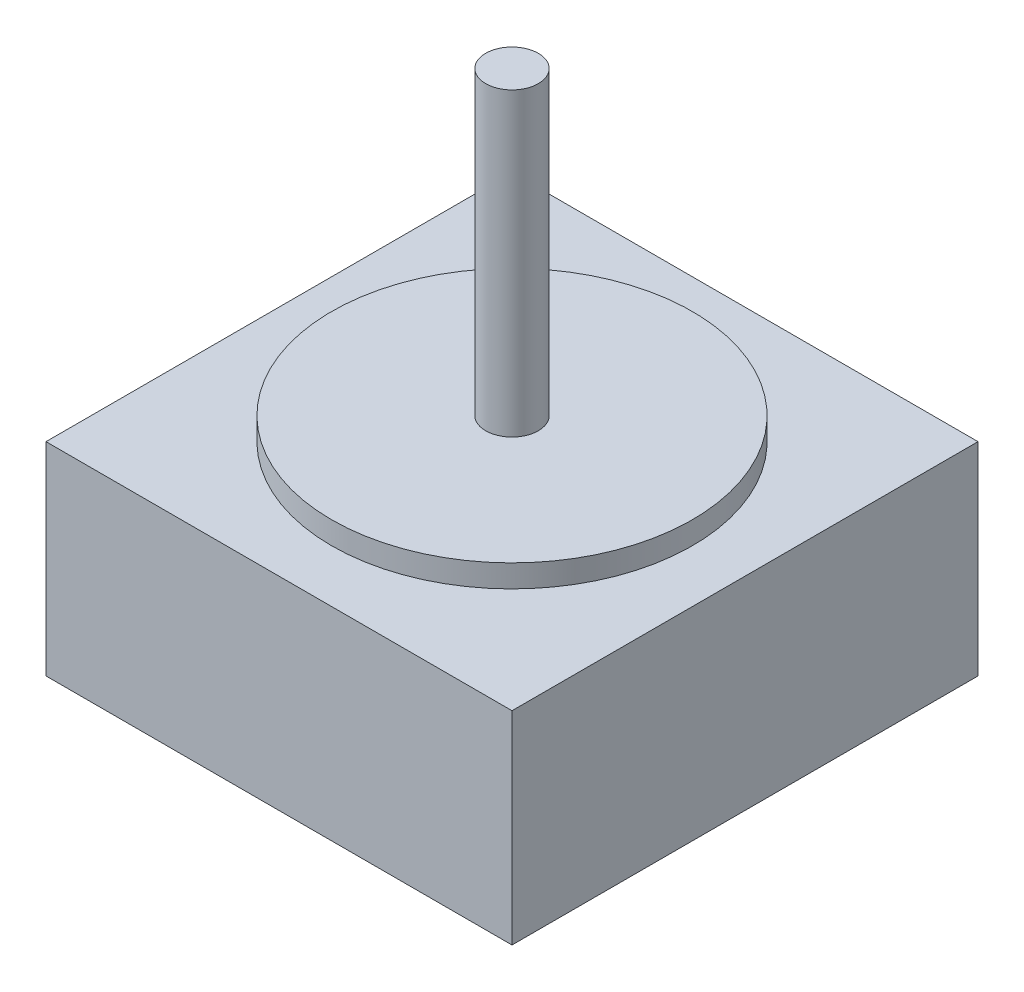
ISO-10303-21;
HEADER;
FILE_DESCRIPTION(('STEP AP214'),'2;1');
FILE_NAME('part.step','',(''),(''),'','','');
FILE_SCHEMA(('AUTOMOTIVE_DESIGN { 1 0 10303 214 1 1 1 1 }'));
ENDSEC;
DATA;
#1=APPLICATION_CONTEXT('core data for automotive mechanical design processes');
#2=APPLICATION_PROTOCOL_DEFINITION('international standard','automotive_design',2000,#1);
#3=PRODUCT_CONTEXT('',#1,'mechanical');
#4=PRODUCT('Part','Part','',(#3));
#5=PRODUCT_RELATED_PRODUCT_CATEGORY('part','',(#4));
#6=PRODUCT_DEFINITION_FORMATION('','',#4);
#7=PRODUCT_DEFINITION_CONTEXT('part definition',#1,'design');
#8=PRODUCT_DEFINITION('design','',#6,#7);
#9=PRODUCT_DEFINITION_SHAPE('','',#8);
#10=(LENGTH_UNIT() NAMED_UNIT(*) SI_UNIT(.MILLI.,.METRE.));
#11=(NAMED_UNIT(*) PLANE_ANGLE_UNIT() SI_UNIT($,.RADIAN.));
#12=(NAMED_UNIT(*) SI_UNIT($,.STERADIAN.) SOLID_ANGLE_UNIT());
#13=UNCERTAINTY_MEASURE_WITH_UNIT(LENGTH_MEASURE(1.E-05),#10,'distance_accuracy_value','');
#14=(GEOMETRIC_REPRESENTATION_CONTEXT(3) GLOBAL_UNCERTAINTY_ASSIGNED_CONTEXT((#13)) GLOBAL_UNIT_ASSIGNED_CONTEXT((#10,
#11,#12)) REPRESENTATION_CONTEXT('',''));
#15=CARTESIAN_POINT('',(0.,0.,0.));
#16=DIRECTION('',(0.,0.,1.));
#17=DIRECTION('',(1.,0.,0.));
#18=AXIS2_PLACEMENT_3D('',#15,#16,#17);
#19=CARTESIAN_POINT('',(31.,27.,31.));
#20=DIRECTION('',(-1.,0.,0.));
#21=DIRECTION('',(0.,0.,1.));
#22=AXIS2_PLACEMENT_3D('',#19,#20,#21);
#23=PLANE('',#22);
#24=DIRECTION('',(0.,0.,-1.));
#25=VECTOR('',#24,1.);
#26=CARTESIAN_POINT('',(31.,0.,31.));
#27=LINE('',#26,#25);
#28=CARTESIAN_POINT('',(31.,0.,31.));
#29=VERTEX_POINT('',#28);
#30=CARTESIAN_POINT('',(31.,0.,-31.));
#31=VERTEX_POINT('',#30);
#32=EDGE_CURVE('E105',#29,#31,#27,.T.);
#33=ORIENTED_EDGE('',*,*,#32,.T.);
#34=DIRECTION('',(0.,-1.,0.));
#35=VECTOR('',#34,1.);
#36=CARTESIAN_POINT('',(31.,27.,-31.));
#37=LINE('',#36,#35);
#38=CARTESIAN_POINT('',(31.,27.,-31.));
#39=VERTEX_POINT('',#38);
#40=EDGE_CURVE('E42',#39,#31,#37,.T.);
#41=ORIENTED_EDGE('',*,*,#40,.F.);
#42=DIRECTION('',(0.,0.,-1.));
#43=VECTOR('',#42,1.);
#44=CARTESIAN_POINT('',(31.,27.,31.));
#45=LINE('',#44,#43);
#46=CARTESIAN_POINT('',(31.,27.,31.));
#47=VERTEX_POINT('',#46);
#48=EDGE_CURVE('E92',#47,#39,#45,.T.);
#49=ORIENTED_EDGE('',*,*,#48,.F.);
#50=DIRECTION('',(0.,-1.,0.));
#51=VECTOR('',#50,1.);
#52=CARTESIAN_POINT('',(31.,27.,31.));
#53=LINE('',#52,#51);
#54=EDGE_CURVE('E101',#47,#29,#53,.T.);
#55=ORIENTED_EDGE('',*,*,#54,.T.);
#56=EDGE_LOOP('',(#33,#41,#49,#55));
#57=FACE_BOUND('',#56,.T.);
#58=ADVANCED_FACE('F39',(#57),#23,.F.);
#59=CARTESIAN_POINT('',(-31.,27.,-31.));
#60=DIRECTION('',(0.,0.,1.));
#61=DIRECTION('',(1.,0.,0.));
#62=AXIS2_PLACEMENT_3D('',#59,#60,#61);
#63=PLANE('',#62);
#64=DIRECTION('',(-1.,0.,0.));
#65=VECTOR('',#64,1.);
#66=CARTESIAN_POINT('',(-31.,0.,-31.));
#67=LINE('',#66,#65);
#68=CARTESIAN_POINT('',(-31.,0.,-31.));
#69=VERTEX_POINT('',#68);
#70=EDGE_CURVE('E97',#31,#69,#67,.T.);
#71=ORIENTED_EDGE('',*,*,#70,.T.);
#72=DIRECTION('',(0.,-1.,0.));
#73=VECTOR('',#72,1.);
#74=CARTESIAN_POINT('',(-31.,27.,-31.));
#75=LINE('',#74,#73);
#76=CARTESIAN_POINT('',(-31.,27.,-31.));
#77=VERTEX_POINT('',#76);
#78=EDGE_CURVE('E95',#77,#69,#75,.T.);
#79=ORIENTED_EDGE('',*,*,#78,.F.);
#80=DIRECTION('',(-1.,0.,0.));
#81=VECTOR('',#80,1.);
#82=CARTESIAN_POINT('',(-31.,27.,-31.));
#83=LINE('',#82,#81);
#84=EDGE_CURVE('E87',#39,#77,#83,.T.);
#85=ORIENTED_EDGE('',*,*,#84,.F.);
#86=ORIENTED_EDGE('',*,*,#40,.T.);
#87=EDGE_LOOP('',(#71,#79,#85,#86));
#88=FACE_BOUND('',#87,.T.);
#89=ADVANCED_FACE('F96',(#88),#63,.F.);
#90=CARTESIAN_POINT('',(-31.,27.,31.));
#91=DIRECTION('',(1.,0.,0.));
#92=DIRECTION('',(0.,0.,-1.));
#93=AXIS2_PLACEMENT_3D('',#90,#91,#92);
#94=PLANE('',#93);
#95=DIRECTION('',(0.,0.,1.));
#96=VECTOR('',#95,1.);
#97=CARTESIAN_POINT('',(-31.,0.,31.));
#98=LINE('',#97,#96);
#99=CARTESIAN_POINT('',(-31.,0.,31.));
#100=VERTEX_POINT('',#99);
#101=EDGE_CURVE('E73',#69,#100,#98,.T.);
#102=ORIENTED_EDGE('',*,*,#101,.T.);
#103=DIRECTION('',(0.,-1.,0.));
#104=VECTOR('',#103,1.);
#105=CARTESIAN_POINT('',(-31.,27.,31.));
#106=LINE('',#105,#104);
#107=CARTESIAN_POINT('',(-31.,27.,31.));
#108=VERTEX_POINT('',#107);
#109=EDGE_CURVE('E98',#108,#100,#106,.T.);
#110=ORIENTED_EDGE('',*,*,#109,.F.);
#111=DIRECTION('',(0.,0.,1.));
#112=VECTOR('',#111,1.);
#113=CARTESIAN_POINT('',(-31.,27.,31.));
#114=LINE('',#113,#112);
#115=EDGE_CURVE('E90',#77,#108,#114,.T.);
#116=ORIENTED_EDGE('',*,*,#115,.F.);
#117=ORIENTED_EDGE('',*,*,#78,.T.);
#118=EDGE_LOOP('',(#102,#110,#116,#117));
#119=FACE_BOUND('',#118,.T.);
#120=ADVANCED_FACE('F99',(#119),#94,.F.);
#121=CARTESIAN_POINT('',(-31.,27.,31.));
#122=DIRECTION('',(0.,0.,-1.));
#123=DIRECTION('',(-1.,0.,0.));
#124=AXIS2_PLACEMENT_3D('',#121,#122,#123);
#125=PLANE('',#124);
#126=DIRECTION('',(1.,0.,0.));
#127=VECTOR('',#126,1.);
#128=CARTESIAN_POINT('',(-31.,0.,31.));
#129=LINE('',#128,#127);
#130=EDGE_CURVE('E79',#100,#29,#129,.T.);
#131=ORIENTED_EDGE('',*,*,#130,.T.);
#132=ORIENTED_EDGE('',*,*,#54,.F.);
#133=DIRECTION('',(1.,0.,0.));
#134=VECTOR('',#133,1.);
#135=CARTESIAN_POINT('',(-31.,27.,31.));
#136=LINE('',#135,#134);
#137=EDGE_CURVE('E56',#108,#47,#136,.T.);
#138=ORIENTED_EDGE('',*,*,#137,.F.);
#139=ORIENTED_EDGE('',*,*,#109,.T.);
#140=EDGE_LOOP('',(#131,#132,#138,#139));
#141=FACE_BOUND('',#140,.T.);
#142=ADVANCED_FACE('F113',(#141),#125,.F.);
#143=CARTESIAN_POINT('',(0.,27.,0.));
#144=DIRECTION('',(0.,-1.,0.));
#145=DIRECTION('',(0.,0.,-1.));
#146=AXIS2_PLACEMENT_3D('',#143,#144,#145);
#147=PLANE('',#146);
#148=CARTESIAN_POINT('',(0.,27.,0.));
#149=DIRECTION('',(0.,1.,0.));
#150=DIRECTION('',(0.,0.,1.));
#151=AXIS2_PLACEMENT_3D('',#148,#149,#150);
#152=CIRCLE('',#151,24.);
#153=CARTESIAN_POINT('',(0.,27.,24.));
#154=VERTEX_POINT('',#153);
#155=EDGE_CURVE('E11',#154,#154,#152,.T.);
#156=ORIENTED_EDGE('',*,*,#155,.F.);
#157=EDGE_LOOP('',(#156));
#158=FACE_BOUND('',#157,.T.);
#159=ORIENTED_EDGE('',*,*,#48,.T.);
#160=ORIENTED_EDGE('',*,*,#84,.T.);
#161=ORIENTED_EDGE('',*,*,#115,.T.);
#162=ORIENTED_EDGE('',*,*,#137,.T.);
#163=EDGE_LOOP('',(#159,#160,#161,#162));
#164=FACE_BOUND('',#163,.T.);
#165=ADVANCED_FACE('F88',(#158,#164),#147,.F.);
#166=CARTESIAN_POINT('',(0.,0.,0.));
#167=DIRECTION('',(0.,-1.,0.));
#168=DIRECTION('',(0.,0.,-1.));
#169=AXIS2_PLACEMENT_3D('',#166,#167,#168);
#170=PLANE('',#169);
#171=ORIENTED_EDGE('',*,*,#32,.F.);
#172=ORIENTED_EDGE('',*,*,#130,.F.);
#173=ORIENTED_EDGE('',*,*,#101,.F.);
#174=ORIENTED_EDGE('',*,*,#70,.F.);
#175=EDGE_LOOP('',(#171,#172,#173,#174));
#176=FACE_BOUND('',#175,.T.);
#177=ADVANCED_FACE('F116',(#176),#170,.T.);
#178=CARTESIAN_POINT('',(0.,30.,0.));
#179=DIRECTION('',(0.,-1.,0.));
#180=DIRECTION('',(0.,0.,-1.));
#181=AXIS2_PLACEMENT_3D('',#178,#179,#180);
#182=CYLINDRICAL_SURFACE('',#181,24.);
#183=CARTESIAN_POINT('',(0.,30.,0.));
#184=DIRECTION('',(0.,1.,0.));
#185=DIRECTION('',(0.,0.,1.));
#186=AXIS2_PLACEMENT_3D('',#183,#184,#185);
#187=CIRCLE('',#186,24.);
#188=CARTESIAN_POINT('',(0.,30.,24.));
#189=VERTEX_POINT('',#188);
#190=EDGE_CURVE('E108',#189,#189,#187,.T.);
#191=ORIENTED_EDGE('',*,*,#190,.F.);
#192=EDGE_LOOP('',(#191));
#193=FACE_BOUND('',#192,.T.);
#194=ORIENTED_EDGE('',*,*,#155,.T.);
#195=EDGE_LOOP('',(#194));
#196=FACE_BOUND('',#195,.T.);
#197=ADVANCED_FACE('F139',(#193,#196),#182,.T.);
#198=CARTESIAN_POINT('',(0.,30.,0.));
#199=DIRECTION('',(0.,1.,0.));
#200=DIRECTION('',(0.,0.,1.));
#201=AXIS2_PLACEMENT_3D('',#198,#199,#200);
#202=PLANE('',#201);
#203=CARTESIAN_POINT('',(0.,30.,0.));
#204=DIRECTION('',(0.,1.,0.));
#205=DIRECTION('',(0.,0.,1.));
#206=AXIS2_PLACEMENT_3D('',#203,#204,#205);
#207=CIRCLE('',#206,3.5);
#208=CARTESIAN_POINT('',(0.,30.,3.5));
#209=VERTEX_POINT('',#208);
#210=EDGE_CURVE('E122',#209,#209,#207,.T.);
#211=ORIENTED_EDGE('',*,*,#210,.F.);
#212=EDGE_LOOP('',(#211));
#213=FACE_BOUND('',#212,.T.);
#214=ORIENTED_EDGE('',*,*,#190,.T.);
#215=EDGE_LOOP('',(#214));
#216=FACE_BOUND('',#215,.T.);
#217=ADVANCED_FACE('F133',(#213,#216),#202,.T.);
#218=CARTESIAN_POINT('',(0.,70.,0.));
#219=DIRECTION('',(0.,-1.,0.));
#220=DIRECTION('',(0.,0.,-1.));
#221=AXIS2_PLACEMENT_3D('',#218,#219,#220);
#222=CYLINDRICAL_SURFACE('',#221,3.5);
#223=CARTESIAN_POINT('',(0.,70.,0.));
#224=DIRECTION('',(0.,1.,0.));
#225=DIRECTION('',(0.,0.,1.));
#226=AXIS2_PLACEMENT_3D('',#223,#224,#225);
#227=CIRCLE('',#226,3.5);
#228=CARTESIAN_POINT('',(0.,70.,3.5));
#229=VERTEX_POINT('',#228);
#230=EDGE_CURVE('E121',#229,#229,#227,.T.);
#231=ORIENTED_EDGE('',*,*,#230,.F.);
#232=EDGE_LOOP('',(#231));
#233=FACE_BOUND('',#232,.T.);
#234=ORIENTED_EDGE('',*,*,#210,.T.);
#235=EDGE_LOOP('',(#234));
#236=FACE_BOUND('',#235,.T.);
#237=ADVANCED_FACE('F130',(#233,#236),#222,.T.);
#238=CARTESIAN_POINT('',(0.,70.,0.));
#239=DIRECTION('',(0.,1.,0.));
#240=DIRECTION('',(0.,0.,1.));
#241=AXIS2_PLACEMENT_3D('',#238,#239,#240);
#242=PLANE('',#241);
#243=ORIENTED_EDGE('',*,*,#230,.T.);
#244=EDGE_LOOP('',(#243));
#245=FACE_BOUND('',#244,.T.);
#246=ADVANCED_FACE('F128',(#245),#242,.T.);
#247=CLOSED_SHELL('',(#58,#89,#120,#142,#165,#177,#197,#217,#237,#246));
#248=MANIFOLD_SOLID_BREP('B2',#247);
#249=ADVANCED_BREP_SHAPE_REPRESENTATION('',(#18,#248),#14);
#250=SHAPE_DEFINITION_REPRESENTATION(#9,#249);
ENDSEC;
END-ISO-10303-21;
